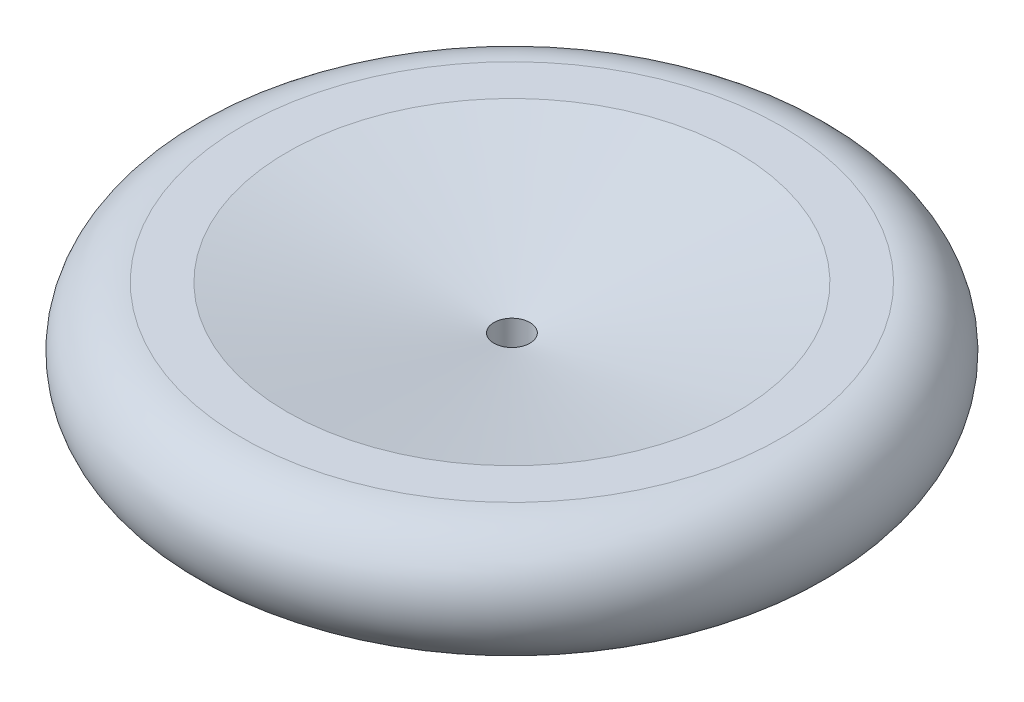
ISO-10303-21;
HEADER;
FILE_DESCRIPTION(('STEP AP214'),'2;1');
FILE_NAME('part.step','',(''),(''),'','','');
FILE_SCHEMA(('AUTOMOTIVE_DESIGN { 1 0 10303 214 1 1 1 1 }'));
ENDSEC;
DATA;
#1=APPLICATION_CONTEXT('core data for automotive mechanical design processes');
#2=APPLICATION_PROTOCOL_DEFINITION('international standard','automotive_design',2000,#1);
#3=PRODUCT_CONTEXT('',#1,'mechanical');
#4=PRODUCT('Part','Part','',(#3));
#5=PRODUCT_RELATED_PRODUCT_CATEGORY('part','',(#4));
#6=PRODUCT_DEFINITION_FORMATION('','',#4);
#7=PRODUCT_DEFINITION_CONTEXT('part definition',#1,'design');
#8=PRODUCT_DEFINITION('design','',#6,#7);
#9=PRODUCT_DEFINITION_SHAPE('','',#8);
#10=(LENGTH_UNIT() NAMED_UNIT(*) SI_UNIT(.MILLI.,.METRE.));
#11=(NAMED_UNIT(*) PLANE_ANGLE_UNIT() SI_UNIT($,.RADIAN.));
#12=(NAMED_UNIT(*) SI_UNIT($,.STERADIAN.) SOLID_ANGLE_UNIT());
#13=UNCERTAINTY_MEASURE_WITH_UNIT(LENGTH_MEASURE(1.E-05),#10,'distance_accuracy_value','');
#14=(GEOMETRIC_REPRESENTATION_CONTEXT(3) GLOBAL_UNCERTAINTY_ASSIGNED_CONTEXT((#13)) GLOBAL_UNIT_ASSIGNED_CONTEXT((#10,
#11,#12)) REPRESENTATION_CONTEXT('',''));
#15=CARTESIAN_POINT('',(0.,0.,0.));
#16=DIRECTION('',(0.,0.,1.));
#17=DIRECTION('',(1.,0.,0.));
#18=AXIS2_PLACEMENT_3D('',#15,#16,#17);
#19=CARTESIAN_POINT('',(0.,-13.277601836821,0.));
#20=DIRECTION('',(0.,-1.,0.));
#21=DIRECTION('',(0.,0.,-1.));
#22=AXIS2_PLACEMENT_3D('',#19,#20,#21);
#23=PLANE('',#22);
#24=CARTESIAN_POINT('',(0.,-13.277601836821,0.));
#25=DIRECTION('',(0.,-1.,0.));
#26=DIRECTION('',(0.,0.,-1.));
#27=AXIS2_PLACEMENT_3D('',#24,#25,#26);
#28=CIRCLE('',#27,60.);
#29=CARTESIAN_POINT('',(0.,-13.277601836821,-60.));
#30=VERTEX_POINT('',#29);
#31=EDGE_CURVE('E10',#30,#30,#28,.T.);
#32=ORIENTED_EDGE('',*,*,#31,.T.);
#33=EDGE_LOOP('',(#32));
#34=FACE_BOUND('',#33,.T.);
#35=CARTESIAN_POINT('',(0.,-13.277601836821,0.));
#36=DIRECTION('',(0.,-1.,0.));
#37=DIRECTION('',(0.,0.,-1.));
#38=AXIS2_PLACEMENT_3D('',#35,#36,#37);
#39=CIRCLE('',#38,50.);
#40=CARTESIAN_POINT('',(0.,-13.277601836821,-50.));
#41=VERTEX_POINT('',#40);
#42=EDGE_CURVE('E66',#41,#41,#39,.T.);
#43=ORIENTED_EDGE('',*,*,#42,.F.);
#44=EDGE_LOOP('',(#43));
#45=FACE_BOUND('',#44,.T.);
#46=ADVANCED_FACE('F39',(#34,#45),#23,.T.);
#47=CARTESIAN_POINT('',(0.,0.,0.));
#48=DIRECTION('',(0.,-1.,0.));
#49=DIRECTION('',(0.,0.,-1.));
#50=AXIS2_PLACEMENT_3D('',#47,#48,#49);
#51=TOROIDAL_SURFACE('',#50,60.,13.277601836821);
#52=CARTESIAN_POINT('',(0.,13.277601836821,0.));
#53=DIRECTION('',(0.,-1.,0.));
#54=DIRECTION('',(0.,0.,-1.));
#55=AXIS2_PLACEMENT_3D('',#52,#53,#54);
#56=CIRCLE('',#55,60.);
#57=CARTESIAN_POINT('',(0.,13.277601836821,-60.));
#58=VERTEX_POINT('',#57);
#59=EDGE_CURVE('E46',#58,#58,#56,.T.);
#60=ORIENTED_EDGE('',*,*,#59,.T.);
#61=EDGE_LOOP('',(#60));
#62=FACE_BOUND('',#61,.T.);
#63=ORIENTED_EDGE('',*,*,#31,.F.);
#64=EDGE_LOOP('',(#63));
#65=FACE_BOUND('',#64,.T.);
#66=ADVANCED_FACE('F75',(#62,#65),#51,.T.);
#67=CARTESIAN_POINT('',(0.,13.277601836821,0.));
#68=DIRECTION('',(0.,-1.,0.));
#69=DIRECTION('',(0.,0.,-1.));
#70=AXIS2_PLACEMENT_3D('',#67,#68,#69);
#71=PLANE('',#70);
#72=ORIENTED_EDGE('',*,*,#59,.F.);
#73=EDGE_LOOP('',(#72));
#74=FACE_BOUND('',#73,.T.);
#75=CARTESIAN_POINT('',(0.,13.277601836821,0.));
#76=DIRECTION('',(0.,-1.,0.));
#77=DIRECTION('',(0.,0.,-1.));
#78=AXIS2_PLACEMENT_3D('',#75,#76,#77);
#79=CIRCLE('',#78,50.);
#80=CARTESIAN_POINT('',(0.,13.277601836821,50.));
#81=VERTEX_POINT('',#80);
#82=EDGE_CURVE('E51',#81,#81,#79,.T.);
#83=ORIENTED_EDGE('',*,*,#82,.T.);
#84=EDGE_LOOP('',(#83));
#85=FACE_BOUND('',#84,.T.);
#86=ADVANCED_FACE('F79',(#74,#85),#71,.F.);
#87=CARTESIAN_POINT('',(0.,3.5,0.));
#88=DIRECTION('',(0.,1.,0.));
#89=DIRECTION('',(0.,0.,1.));
#90=AXIS2_PLACEMENT_3D('',#87,#88,#89);
#91=CONICAL_SURFACE('',#90,4.,1.36135681655558);
#92=CARTESIAN_POINT('',(0.,3.5,0.));
#93=DIRECTION('',(0.,-1.,0.));
#94=DIRECTION('',(0.,0.,-1.));
#95=AXIS2_PLACEMENT_3D('',#92,#93,#94);
#96=CIRCLE('',#95,4.);
#97=CARTESIAN_POINT('',(0.,3.5,4.));
#98=VERTEX_POINT('',#97);
#99=EDGE_CURVE('E56',#98,#98,#96,.T.);
#100=CARTESIAN_POINT('',(0.,13.277601836821,50.));
#101=CARTESIAN_POINT('',(0.,13.1757518176875,49.5208333333333));
#102=CARTESIAN_POINT('',(0.,13.0739017985539,49.0416666666667));
#103=CARTESIAN_POINT('',(0.,12.8702017602868,48.0833333333333));
#104=CARTESIAN_POINT('',(0.,12.7683517411533,47.6041666666667));
#105=CARTESIAN_POINT('',(0.,12.5646517028862,46.6458333333333));
#106=CARTESIAN_POINT('',(0.,12.4628016837526,46.1666666666667));
#107=CARTESIAN_POINT('',(0.,12.2591016454855,45.2083333333333));
#108=CARTESIAN_POINT('',(0.,12.157251626352,44.7291666666667));
#109=CARTESIAN_POINT('',(0.,11.9535515880849,43.7708333333333));
#110=CARTESIAN_POINT('',(0.,11.8517015689513,43.2916666666667));
#111=CARTESIAN_POINT('',(0.,11.6480015306842,42.3333333333333));
#112=CARTESIAN_POINT('',(0.,11.5461515115507,41.8541666666667));
#113=CARTESIAN_POINT('',(0.,11.3424514732835,40.8958333333333));
#114=CARTESIAN_POINT('',(0.,11.24060145415,40.4166666666667));
#115=CARTESIAN_POINT('',(0.,11.0369014158829,39.4583333333333));
#116=CARTESIAN_POINT('',(0.,10.9350513967493,38.9791666666667));
#117=CARTESIAN_POINT('',(0.,10.7313513584822,38.0208333333333));
#118=CARTESIAN_POINT('',(0.,10.6295013393487,37.5416666666667));
#119=CARTESIAN_POINT('',(0.,10.4258013010816,36.5833333333333));
#120=CARTESIAN_POINT('',(0.,10.323951281948,36.1041666666667));
#121=CARTESIAN_POINT('',(0.,10.1202512436809,35.1458333333333));
#122=CARTESIAN_POINT('',(0.,10.0184012245474,34.6666666666667));
#123=CARTESIAN_POINT('',(0.,9.81470118628026,33.7083333333333));
#124=CARTESIAN_POINT('',(0.,9.7128511671467,33.2291666666667));
#125=CARTESIAN_POINT('',(0.,9.5091511288796,32.2708333333333));
#126=CARTESIAN_POINT('',(0.,9.40730110974605,31.7916666666667));
#127=CARTESIAN_POINT('',(0.,9.20360107147894,30.8333333333333));
#128=CARTESIAN_POINT('',(0.,9.10175105234539,30.3541666666667));
#129=CARTESIAN_POINT('',(0.,8.89805101407828,29.3958333333333));
#130=CARTESIAN_POINT('',(0.,8.79620099494473,28.9166666666667));
#131=CARTESIAN_POINT('',(0.,8.59250095667763,27.9583333333333));
#132=CARTESIAN_POINT('',(0.,8.49065093754407,27.4791666666667));
#133=CARTESIAN_POINT('',(0.,8.28695089927697,26.5208333333333));
#134=CARTESIAN_POINT('',(0.,8.18510088014342,26.0416666666667));
#135=CARTESIAN_POINT('',(0.,7.98140084187631,25.0833333333333));
#136=CARTESIAN_POINT('',(0.,7.87955082274276,24.6041666666667));
#137=CARTESIAN_POINT('',(0.,7.67585078447565,23.6458333333333));
#138=CARTESIAN_POINT('',(0.,7.5740007653421,23.1666666666667));
#139=CARTESIAN_POINT('',(0.,7.370300727075,22.2083333333333));
#140=CARTESIAN_POINT('',(0.,7.26845070794144,21.7291666666667));
#141=CARTESIAN_POINT('',(0.,7.06475066967434,20.7708333333333));
#142=CARTESIAN_POINT('',(0.,6.96290065054079,20.2916666666667));
#143=CARTESIAN_POINT('',(0.,6.75920061227368,19.3333333333333));
#144=CARTESIAN_POINT('',(0.,6.65735059314013,18.8541666666667));
#145=CARTESIAN_POINT('',(0.,6.45365055487302,17.8958333333333));
#146=CARTESIAN_POINT('',(0.,6.35180053573947,17.4166666666667));
#147=CARTESIAN_POINT('',(0.,6.14810049747237,16.4583333333333));
#148=CARTESIAN_POINT('',(0.,6.04625047833881,15.9791666666667));
#149=CARTESIAN_POINT('',(0.,5.84255044007171,15.0208333333333));
#150=CARTESIAN_POINT('',(0.,5.74070042093816,14.5416666666667));
#151=CARTESIAN_POINT('',(0.,5.53700038267105,13.5833333333333));
#152=CARTESIAN_POINT('',(0.,5.4351503635375,13.1041666666667));
#153=CARTESIAN_POINT('',(0.,5.23145032527039,12.1458333333333));
#154=CARTESIAN_POINT('',(0.,5.12960030613684,11.6666666666667));
#155=CARTESIAN_POINT('',(0.,4.92590026786974,10.7083333333333));
#156=CARTESIAN_POINT('',(0.,4.82405024873618,10.2291666666667));
#157=CARTESIAN_POINT('',(0.,4.62035021046908,9.27083333333333));
#158=CARTESIAN_POINT('',(0.,4.51850019133552,8.79166666666667));
#159=CARTESIAN_POINT('',(0.,4.31480015306842,7.83333333333333));
#160=CARTESIAN_POINT('',(0.,4.21295013393487,7.35416666666667));
#161=CARTESIAN_POINT('',(0.,4.00925009566776,6.39583333333333));
#162=CARTESIAN_POINT('',(0.,3.90740007653421,5.91666666666667));
#163=CARTESIAN_POINT('',(0.,3.70370003826711,4.95833333333333));
#164=CARTESIAN_POINT('',(0.,3.60185001913355,4.47916666666667));
#165=CARTESIAN_POINT('',(0.,3.5,4.));
#166=B_SPLINE_CURVE_WITH_KNOTS('',3,(#100,#101,#102,#103,#104,#105,#106,#107,#108,#109,#110,
#111,#112,#113,#114,#115,#116,#117,#118,#119,#120,#121,#122,#123,#124,#125,#126,#127,#128,#129,
#130,#131,#132,#133,#134,#135,#136,#137,#138,#139,#140,#141,#142,#143,#144,#145,#146,#147,#148,
#149,#150,#151,#152,#153,#154,#155,#156,#157,#158,#159,#160,#161,#162,#163,#164,#165),
.UNSPECIFIED.,.F.,.F.,(4,2,2,2,2,2,2,2,2,2,2,2,2,2,2,2,2,2,2,2,2,2,2,2,2,2,2,2,2,2,2,2,4),(0.,
1.46961460511847,2.93922921023696,4.40884381535544,5.87845842047392,7.3480730255924,
8.81768763071089,10.2873022358294,11.7569168409478,13.2265314460663,14.6961460511848,
16.1657606563033,17.6353752614218,19.1049898665402,20.5746044716587,22.0442190767772,
23.5138336818957,24.9834482870142,26.4530628921326,27.9226774972511,29.3922921023696,
30.8619067074881,32.3315213126065,33.801135917725,35.2707505228435,36.740365127962,
38.2099797330805,39.6795943381989,41.1492089433174,42.6188235484359,44.0884381535544,
45.5580527586729,47.0276673637913),.UNSPECIFIED.);
#167=EDGE_CURVE('BSEAM83',#81,#98,#166,.T.);
#168=ORIENTED_EDGE('',*,*,#82,.F.);
#169=ORIENTED_EDGE('',*,*,#99,.T.);
#170=ORIENTED_EDGE('',*,*,#167,.T.);
#171=ORIENTED_EDGE('',*,*,#167,.F.);
#172=EDGE_LOOP('',(#168,#170,#169,#171));
#173=FACE_BOUND('',#172,.T.);
#174=ADVANCED_FACE('F83',(#173),#91,.F.);
#175=CARTESIAN_POINT('',(0.,0.,0.));
#176=DIRECTION('',(0.,-1.,0.));
#177=DIRECTION('',(0.,0.,-1.));
#178=AXIS2_PLACEMENT_3D('',#175,#176,#177);
#179=CYLINDRICAL_SURFACE('',#178,4.);
#180=ORIENTED_EDGE('',*,*,#99,.F.);
#181=EDGE_LOOP('',(#180));
#182=FACE_BOUND('',#181,.T.);
#183=CARTESIAN_POINT('',(0.,-3.5,0.));
#184=DIRECTION('',(0.,-1.,0.));
#185=DIRECTION('',(0.,0.,-1.));
#186=AXIS2_PLACEMENT_3D('',#183,#184,#185);
#187=CIRCLE('',#186,4.);
#188=CARTESIAN_POINT('',(0.,-3.5,-4.));
#189=VERTEX_POINT('',#188);
#190=EDGE_CURVE('E62',#189,#189,#187,.T.);
#191=ORIENTED_EDGE('',*,*,#190,.T.);
#192=EDGE_LOOP('',(#191));
#193=FACE_BOUND('',#192,.T.);
#194=ADVANCED_FACE('F90',(#182,#193),#179,.F.);
#195=CARTESIAN_POINT('',(0.,-3.5,0.));
#196=DIRECTION('',(0.,-1.,0.));
#197=DIRECTION('',(0.,0.,-1.));
#198=AXIS2_PLACEMENT_3D('',#195,#196,#197);
#199=CONICAL_SURFACE('',#198,4.,1.36135681655558);
#200=CARTESIAN_POINT('',(0.,-13.277601836821,-50.));
#201=CARTESIAN_POINT('',(0.,-13.1757518176875,-49.5208333333333));
#202=CARTESIAN_POINT('',(0.,-13.0739017985539,-49.0416666666667));
#203=CARTESIAN_POINT('',(0.,-12.8702017602868,-48.0833333333333));
#204=CARTESIAN_POINT('',(0.,-12.7683517411533,-47.6041666666667));
#205=CARTESIAN_POINT('',(0.,-12.5646517028862,-46.6458333333333));
#206=CARTESIAN_POINT('',(0.,-12.4628016837526,-46.1666666666667));
#207=CARTESIAN_POINT('',(0.,-12.2591016454855,-45.2083333333333));
#208=CARTESIAN_POINT('',(0.,-12.157251626352,-44.7291666666667));
#209=CARTESIAN_POINT('',(0.,-11.9535515880849,-43.7708333333333));
#210=CARTESIAN_POINT('',(0.,-11.8517015689513,-43.2916666666667));
#211=CARTESIAN_POINT('',(0.,-11.6480015306842,-42.3333333333333));
#212=CARTESIAN_POINT('',(0.,-11.5461515115507,-41.8541666666667));
#213=CARTESIAN_POINT('',(0.,-11.3424514732835,-40.8958333333333));
#214=CARTESIAN_POINT('',(0.,-11.24060145415,-40.4166666666667));
#215=CARTESIAN_POINT('',(0.,-11.0369014158829,-39.4583333333333));
#216=CARTESIAN_POINT('',(0.,-10.9350513967493,-38.9791666666667));
#217=CARTESIAN_POINT('',(0.,-10.7313513584822,-38.0208333333333));
#218=CARTESIAN_POINT('',(0.,-10.6295013393487,-37.5416666666667));
#219=CARTESIAN_POINT('',(0.,-10.4258013010816,-36.5833333333333));
#220=CARTESIAN_POINT('',(0.,-10.323951281948,-36.1041666666667));
#221=CARTESIAN_POINT('',(0.,-10.1202512436809,-35.1458333333333));
#222=CARTESIAN_POINT('',(0.,-10.0184012245474,-34.6666666666667));
#223=CARTESIAN_POINT('',(0.,-9.81470118628026,-33.7083333333333));
#224=CARTESIAN_POINT('',(0.,-9.7128511671467,-33.2291666666667));
#225=CARTESIAN_POINT('',(0.,-9.5091511288796,-32.2708333333333));
#226=CARTESIAN_POINT('',(0.,-9.40730110974605,-31.7916666666667));
#227=CARTESIAN_POINT('',(0.,-9.20360107147894,-30.8333333333333));
#228=CARTESIAN_POINT('',(0.,-9.10175105234539,-30.3541666666667));
#229=CARTESIAN_POINT('',(0.,-8.89805101407828,-29.3958333333333));
#230=CARTESIAN_POINT('',(0.,-8.79620099494473,-28.9166666666667));
#231=CARTESIAN_POINT('',(0.,-8.59250095667763,-27.9583333333333));
#232=CARTESIAN_POINT('',(0.,-8.49065093754407,-27.4791666666667));
#233=CARTESIAN_POINT('',(0.,-8.28695089927697,-26.5208333333333));
#234=CARTESIAN_POINT('',(0.,-8.18510088014342,-26.0416666666667));
#235=CARTESIAN_POINT('',(0.,-7.98140084187631,-25.0833333333333));
#236=CARTESIAN_POINT('',(0.,-7.87955082274276,-24.6041666666667));
#237=CARTESIAN_POINT('',(0.,-7.67585078447565,-23.6458333333333));
#238=CARTESIAN_POINT('',(0.,-7.5740007653421,-23.1666666666667));
#239=CARTESIAN_POINT('',(0.,-7.370300727075,-22.2083333333333));
#240=CARTESIAN_POINT('',(0.,-7.26845070794144,-21.7291666666667));
#241=CARTESIAN_POINT('',(0.,-7.06475066967434,-20.7708333333333));
#242=CARTESIAN_POINT('',(0.,-6.96290065054079,-20.2916666666667));
#243=CARTESIAN_POINT('',(0.,-6.75920061227368,-19.3333333333333));
#244=CARTESIAN_POINT('',(0.,-6.65735059314013,-18.8541666666667));
#245=CARTESIAN_POINT('',(0.,-6.45365055487302,-17.8958333333333));
#246=CARTESIAN_POINT('',(0.,-6.35180053573947,-17.4166666666667));
#247=CARTESIAN_POINT('',(0.,-6.14810049747237,-16.4583333333333));
#248=CARTESIAN_POINT('',(0.,-6.04625047833881,-15.9791666666667));
#249=CARTESIAN_POINT('',(0.,-5.84255044007171,-15.0208333333333));
#250=CARTESIAN_POINT('',(0.,-5.74070042093816,-14.5416666666667));
#251=CARTESIAN_POINT('',(0.,-5.53700038267105,-13.5833333333333));
#252=CARTESIAN_POINT('',(0.,-5.4351503635375,-13.1041666666667));
#253=CARTESIAN_POINT('',(0.,-5.23145032527039,-12.1458333333333));
#254=CARTESIAN_POINT('',(0.,-5.12960030613684,-11.6666666666667));
#255=CARTESIAN_POINT('',(0.,-4.92590026786974,-10.7083333333333));
#256=CARTESIAN_POINT('',(0.,-4.82405024873618,-10.2291666666667));
#257=CARTESIAN_POINT('',(0.,-4.62035021046908,-9.27083333333333));
#258=CARTESIAN_POINT('',(0.,-4.51850019133552,-8.79166666666667));
#259=CARTESIAN_POINT('',(0.,-4.31480015306842,-7.83333333333333));
#260=CARTESIAN_POINT('',(0.,-4.21295013393487,-7.35416666666667));
#261=CARTESIAN_POINT('',(0.,-4.00925009566776,-6.39583333333333));
#262=CARTESIAN_POINT('',(0.,-3.90740007653421,-5.91666666666667));
#263=CARTESIAN_POINT('',(0.,-3.7037000382671,-4.95833333333333));
#264=CARTESIAN_POINT('',(0.,-3.60185001913355,-4.47916666666667));
#265=CARTESIAN_POINT('',(0.,-3.5,-4.));
#266=B_SPLINE_CURVE_WITH_KNOTS('',3,(#200,#201,#202,#203,#204,#205,#206,#207,#208,#209,#210,
#211,#212,#213,#214,#215,#216,#217,#218,#219,#220,#221,#222,#223,#224,#225,#226,#227,#228,#229,
#230,#231,#232,#233,#234,#235,#236,#237,#238,#239,#240,#241,#242,#243,#244,#245,#246,#247,#248,
#249,#250,#251,#252,#253,#254,#255,#256,#257,#258,#259,#260,#261,#262,#263,#264,#265),
.UNSPECIFIED.,.F.,.F.,(4,2,2,2,2,2,2,2,2,2,2,2,2,2,2,2,2,2,2,2,2,2,2,2,2,2,2,2,2,2,2,2,4),(0.,
1.46961460511847,2.93922921023696,4.40884381535544,5.87845842047392,7.34807302559239,
8.81768763071088,10.2873022358294,11.7569168409478,13.2265314460663,14.6961460511848,
16.1657606563033,17.6353752614218,19.1049898665402,20.5746044716587,22.0442190767772,
23.5138336818957,24.9834482870142,26.4530628921326,27.9226774972511,29.3922921023696,
30.8619067074881,32.3315213126065,33.801135917725,35.2707505228435,36.740365127962,
38.2099797330805,39.6795943381989,41.1492089433174,42.6188235484359,44.0884381535544,
45.5580527586729,47.0276673637913),.UNSPECIFIED.);
#267=EDGE_CURVE('BSEAM71',#41,#189,#266,.T.);
#268=ORIENTED_EDGE('',*,*,#42,.T.);
#269=ORIENTED_EDGE('',*,*,#190,.F.);
#270=ORIENTED_EDGE('',*,*,#267,.T.);
#271=ORIENTED_EDGE('',*,*,#267,.F.);
#272=EDGE_LOOP('',(#268,#270,#269,#271));
#273=FACE_BOUND('',#272,.T.);
#274=ADVANCED_FACE('F71',(#273),#199,.F.);
#275=CLOSED_SHELL('',(#46,#66,#86,#174,#194,#274));
#276=MANIFOLD_SOLID_BREP('B2',#275);
#277=ADVANCED_BREP_SHAPE_REPRESENTATION('',(#18,#276),#14);
#278=SHAPE_DEFINITION_REPRESENTATION(#9,#277);
ENDSEC;
END-ISO-10303-21;
